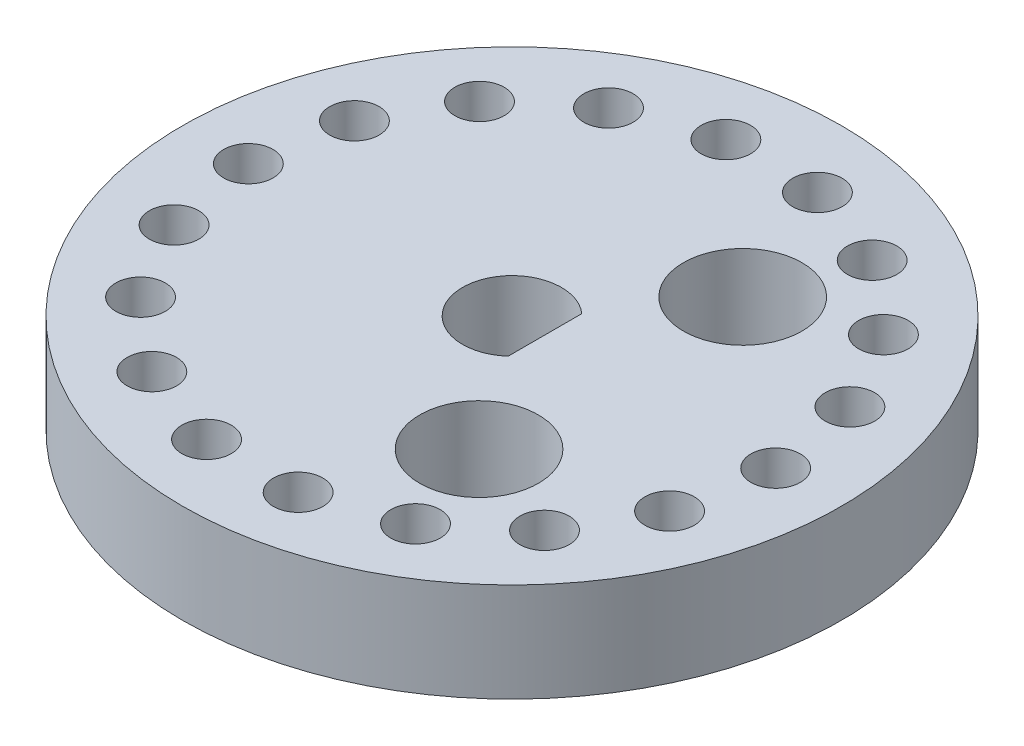
ISO-10303-21;
HEADER;
FILE_DESCRIPTION(('STEP AP214'),'2;1');
FILE_NAME('part.step','',(''),(''),'','','');
FILE_SCHEMA(('AUTOMOTIVE_DESIGN { 1 0 10303 214 1 1 1 1 }'));
ENDSEC;
DATA;
#1=APPLICATION_CONTEXT('core data for automotive mechanical design processes');
#2=APPLICATION_PROTOCOL_DEFINITION('international standard','automotive_design',2000,#1);
#3=PRODUCT_CONTEXT('',#1,'mechanical');
#4=PRODUCT('Part','Part','',(#3));
#5=PRODUCT_RELATED_PRODUCT_CATEGORY('part','',(#4));
#6=PRODUCT_DEFINITION_FORMATION('','',#4);
#7=PRODUCT_DEFINITION_CONTEXT('part definition',#1,'design');
#8=PRODUCT_DEFINITION('design','',#6,#7);
#9=PRODUCT_DEFINITION_SHAPE('','',#8);
#10=(LENGTH_UNIT() NAMED_UNIT(*) SI_UNIT(.MILLI.,.METRE.));
#11=(NAMED_UNIT(*) PLANE_ANGLE_UNIT() SI_UNIT($,.RADIAN.));
#12=(NAMED_UNIT(*) SI_UNIT($,.STERADIAN.) SOLID_ANGLE_UNIT());
#13=UNCERTAINTY_MEASURE_WITH_UNIT(LENGTH_MEASURE(1.E-05),#10,'distance_accuracy_value','');
#14=(GEOMETRIC_REPRESENTATION_CONTEXT(3) GLOBAL_UNCERTAINTY_ASSIGNED_CONTEXT((#13)) GLOBAL_UNIT_ASSIGNED_CONTEXT((#10,
#11,#12)) REPRESENTATION_CONTEXT('',''));
#15=CARTESIAN_POINT('',(0.,0.,0.));
#16=DIRECTION('',(0.,0.,1.));
#17=DIRECTION('',(1.,0.,0.));
#18=AXIS2_PLACEMENT_3D('',#15,#16,#17);
#19=CARTESIAN_POINT('',(0.,3.,0.));
#20=DIRECTION('',(0.,-1.,0.));
#21=DIRECTION('',(0.,0.,-1.));
#22=AXIS2_PLACEMENT_3D('',#19,#20,#21);
#23=CYLINDRICAL_SURFACE('',#22,10.);
#24=CARTESIAN_POINT('',(0.,3.,0.));
#25=DIRECTION('',(0.,1.,0.));
#26=DIRECTION('',(0.,0.,1.));
#27=AXIS2_PLACEMENT_3D('',#24,#25,#26);
#28=CIRCLE('',#27,10.);
#29=CARTESIAN_POINT('',(0.,3.,10.));
#30=VERTEX_POINT('',#29);
#31=EDGE_CURVE('E11',#30,#30,#28,.T.);
#32=ORIENTED_EDGE('',*,*,#31,.F.);
#33=EDGE_LOOP('',(#32));
#34=FACE_BOUND('',#33,.T.);
#35=CARTESIAN_POINT('',(0.,0.,0.));
#36=DIRECTION('',(0.,1.,0.));
#37=DIRECTION('',(0.,0.,1.));
#38=AXIS2_PLACEMENT_3D('',#35,#36,#37);
#39=CIRCLE('',#38,10.);
#40=CARTESIAN_POINT('',(0.,0.,10.));
#41=VERTEX_POINT('',#40);
#42=EDGE_CURVE('E41',#41,#41,#39,.T.);
#43=ORIENTED_EDGE('',*,*,#42,.T.);
#44=EDGE_LOOP('',(#43));
#45=FACE_BOUND('',#44,.T.);
#46=ADVANCED_FACE('F38',(#34,#45),#23,.T.);
#47=CARTESIAN_POINT('',(0.,3.,0.));
#48=DIRECTION('',(0.,1.,0.));
#49=DIRECTION('',(0.,0.,1.));
#50=AXIS2_PLACEMENT_3D('',#47,#48,#49);
#51=PLANE('',#50);
#52=CARTESIAN_POINT('',(0.,3.,0.));
#53=DIRECTION('',(0.,1.,0.));
#54=DIRECTION('',(0.,0.,1.));
#55=AXIS2_PLACEMENT_3D('',#52,#53,#54);
#56=CIRCLE('',#55,1.5);
#57=CARTESIAN_POINT('',(1.,3.,-1.1180339887499));
#58=VERTEX_POINT('',#57);
#59=CARTESIAN_POINT('',(1.,3.,1.1180339887499));
#60=VERTEX_POINT('',#59);
#61=EDGE_CURVE('E52',#58,#60,#56,.T.);
#62=ORIENTED_EDGE('',*,*,#61,.F.);
#63=DIRECTION('',(0.,0.,-1.));
#64=VECTOR('',#63,1.);
#65=CARTESIAN_POINT('',(1.,3.,-1.1180339887499));
#66=LINE('',#65,#64);
#67=EDGE_CURVE('E69',#60,#58,#66,.T.);
#68=ORIENTED_EDGE('',*,*,#67,.F.);
#69=EDGE_LOOP('',(#62,#68));
#70=FACE_BOUND('',#69,.T.);
#71=CARTESIAN_POINT('',(3.,3.,4.));
#72=DIRECTION('',(0.,1.,0.));
#73=DIRECTION('',(0.,0.,1.));
#74=AXIS2_PLACEMENT_3D('',#71,#72,#73);
#75=CIRCLE('',#74,1.8);
#76=CARTESIAN_POINT('',(3.,3.,5.8));
#77=VERTEX_POINT('',#76);
#78=EDGE_CURVE('E88',#77,#77,#75,.T.);
#79=ORIENTED_EDGE('',*,*,#78,.F.);
#80=EDGE_LOOP('',(#79));
#81=FACE_BOUND('',#80,.T.);
#82=CARTESIAN_POINT('',(3.,3.,-4.));
#83=DIRECTION('',(0.,1.,0.));
#84=DIRECTION('',(0.,0.,-1.));
#85=AXIS2_PLACEMENT_3D('',#82,#83,#84);
#86=CIRCLE('',#85,1.8);
#87=CARTESIAN_POINT('',(3.,3.,-5.8));
#88=VERTEX_POINT('',#87);
#89=EDGE_CURVE('E75',#88,#88,#86,.T.);
#90=ORIENTED_EDGE('',*,*,#89,.F.);
#91=EDGE_LOOP('',(#90));
#92=FACE_BOUND('',#91,.T.);
#93=CARTESIAN_POINT('',(7.51754096628726,3.,2.73616114660536));
#94=DIRECTION('',(0.,1.,0.));
#95=DIRECTION('',(0.,0.,1.));
#96=AXIS2_PLACEMENT_3D('',#93,#94,#95);
#97=CIRCLE('',#96,0.750000000000001);
#98=CARTESIAN_POINT('',(7.51754096628726,3.,3.48616114660536));
#99=VERTEX_POINT('',#98);
#100=EDGE_CURVE('E106',#99,#99,#97,.T.);
#101=ORIENTED_EDGE('',*,*,#100,.F.);
#102=EDGE_LOOP('',(#101));
#103=FACE_BOUND('',#102,.T.);
#104=CARTESIAN_POINT('',(6.12835554495182,3.,5.14230087749233));
#105=DIRECTION('',(0.,1.,0.));
#106=DIRECTION('',(0.,0.,1.));
#107=AXIS2_PLACEMENT_3D('',#104,#105,#106);
#108=CIRCLE('',#107,0.750000000000001);
#109=CARTESIAN_POINT('',(6.12835554495182,3.,5.89230087749233));
#110=VERTEX_POINT('',#109);
#111=EDGE_CURVE('E112',#110,#110,#108,.T.);
#112=ORIENTED_EDGE('',*,*,#111,.F.);
#113=EDGE_LOOP('',(#112));
#114=FACE_BOUND('',#113,.T.);
#115=CARTESIAN_POINT('',(3.99999999999998,3.,6.92820323027552));
#116=DIRECTION('',(0.,1.,0.));
#117=DIRECTION('',(0.,0.,1.));
#118=AXIS2_PLACEMENT_3D('',#115,#116,#117);
#119=CIRCLE('',#118,0.75);
#120=CARTESIAN_POINT('',(3.99999999999998,3.,7.67820323027552));
#121=VERTEX_POINT('',#120);
#122=EDGE_CURVE('E118',#121,#121,#119,.T.);
#123=ORIENTED_EDGE('',*,*,#122,.F.);
#124=EDGE_LOOP('',(#123));
#125=FACE_BOUND('',#124,.T.);
#126=CARTESIAN_POINT('',(1.38918542133542,3.,7.87846202409767));
#127=DIRECTION('',(0.,1.,0.));
#128=DIRECTION('',(0.,0.,1.));
#129=AXIS2_PLACEMENT_3D('',#126,#127,#128);
#130=CIRCLE('',#129,0.75);
#131=CARTESIAN_POINT('',(1.38918542133542,3.,8.62846202409767));
#132=VERTEX_POINT('',#131);
#133=EDGE_CURVE('E124',#132,#132,#130,.T.);
#134=ORIENTED_EDGE('',*,*,#133,.F.);
#135=EDGE_LOOP('',(#134));
#136=FACE_BOUND('',#135,.T.);
#137=CARTESIAN_POINT('',(-1.38918542133547,3.,7.87846202409766));
#138=DIRECTION('',(0.,1.,0.));
#139=DIRECTION('',(0.,0.,1.));
#140=AXIS2_PLACEMENT_3D('',#137,#138,#139);
#141=CIRCLE('',#140,0.749999999999999);
#142=CARTESIAN_POINT('',(-1.38918542133547,3.,8.62846202409766));
#143=VERTEX_POINT('',#142);
#144=EDGE_CURVE('E130',#143,#143,#141,.T.);
#145=ORIENTED_EDGE('',*,*,#144,.F.);
#146=EDGE_LOOP('',(#145));
#147=FACE_BOUND('',#146,.T.);
#148=CARTESIAN_POINT('',(-4.00000000000003,3.,6.92820323027549));
#149=DIRECTION('',(0.,1.,0.));
#150=DIRECTION('',(0.,0.,1.));
#151=AXIS2_PLACEMENT_3D('',#148,#149,#150);
#152=CIRCLE('',#151,0.75);
#153=CARTESIAN_POINT('',(-4.00000000000003,3.,7.67820323027549));
#154=VERTEX_POINT('',#153);
#155=EDGE_CURVE('E136',#154,#154,#152,.T.);
#156=ORIENTED_EDGE('',*,*,#155,.F.);
#157=EDGE_LOOP('',(#156));
#158=FACE_BOUND('',#157,.T.);
#159=CARTESIAN_POINT('',(-6.12835554495185,3.,5.14230087749228));
#160=DIRECTION('',(0.,1.,0.));
#161=DIRECTION('',(0.,0.,1.));
#162=AXIS2_PLACEMENT_3D('',#159,#160,#161);
#163=CIRCLE('',#162,0.75);
#164=CARTESIAN_POINT('',(-6.12835554495185,3.,5.89230087749228));
#165=VERTEX_POINT('',#164);
#166=EDGE_CURVE('E142',#165,#165,#163,.T.);
#167=ORIENTED_EDGE('',*,*,#166,.F.);
#168=EDGE_LOOP('',(#167));
#169=FACE_BOUND('',#168,.T.);
#170=CARTESIAN_POINT('',(-7.51754096628728,3.,2.7361611466053));
#171=DIRECTION('',(0.,1.,0.));
#172=DIRECTION('',(0.,0.,1.));
#173=AXIS2_PLACEMENT_3D('',#170,#171,#172);
#174=CIRCLE('',#173,0.75);
#175=CARTESIAN_POINT('',(-7.51754096628728,3.,3.4861611466053));
#176=VERTEX_POINT('',#175);
#177=EDGE_CURVE('E148',#176,#176,#174,.T.);
#178=ORIENTED_EDGE('',*,*,#177,.F.);
#179=EDGE_LOOP('',(#178));
#180=FACE_BOUND('',#179,.T.);
#181=CARTESIAN_POINT('',(-8.,3.,0.));
#182=DIRECTION('',(0.,1.,0.));
#183=DIRECTION('',(0.,0.,1.));
#184=AXIS2_PLACEMENT_3D('',#181,#182,#183);
#185=CIRCLE('',#184,0.750000000000001);
#186=CARTESIAN_POINT('',(-8.,3.,0.749999999999945));
#187=VERTEX_POINT('',#186);
#188=EDGE_CURVE('E154',#187,#187,#185,.T.);
#189=ORIENTED_EDGE('',*,*,#188,.F.);
#190=EDGE_LOOP('',(#189));
#191=FACE_BOUND('',#190,.T.);
#192=CARTESIAN_POINT('',(-7.51754096628725,3.,-2.73616114660541));
#193=DIRECTION('',(0.,1.,0.));
#194=DIRECTION('',(0.,0.,1.));
#195=AXIS2_PLACEMENT_3D('',#192,#193,#194);
#196=CIRCLE('',#195,0.75);
#197=CARTESIAN_POINT('',(-7.51754096628725,3.,-1.98616114660541));
#198=VERTEX_POINT('',#197);
#199=EDGE_CURVE('E160',#198,#198,#196,.T.);
#200=ORIENTED_EDGE('',*,*,#199,.F.);
#201=EDGE_LOOP('',(#200));
#202=FACE_BOUND('',#201,.T.);
#203=CARTESIAN_POINT('',(-6.12835554495178,3.,-5.14230087749237));
#204=DIRECTION('',(0.,1.,0.));
#205=DIRECTION('',(0.,0.,1.));
#206=AXIS2_PLACEMENT_3D('',#203,#204,#205);
#207=CIRCLE('',#206,0.75);
#208=CARTESIAN_POINT('',(-6.12835554495178,3.,-4.39230087749237));
#209=VERTEX_POINT('',#208);
#210=EDGE_CURVE('E166',#209,#209,#207,.T.);
#211=ORIENTED_EDGE('',*,*,#210,.F.);
#212=EDGE_LOOP('',(#211));
#213=FACE_BOUND('',#212,.T.);
#214=CARTESIAN_POINT('',(-3.99999999999994,3.,-6.92820323027555));
#215=DIRECTION('',(0.,1.,0.));
#216=DIRECTION('',(0.,0.,1.));
#217=AXIS2_PLACEMENT_3D('',#214,#215,#216);
#218=CIRCLE('',#217,0.75);
#219=CARTESIAN_POINT('',(-3.99999999999994,3.,-6.17820323027555));
#220=VERTEX_POINT('',#219);
#221=EDGE_CURVE('E172',#220,#220,#218,.T.);
#222=ORIENTED_EDGE('',*,*,#221,.F.);
#223=EDGE_LOOP('',(#222));
#224=FACE_BOUND('',#223,.T.);
#225=CARTESIAN_POINT('',(-1.38918542133537,3.,-7.87846202409768));
#226=DIRECTION('',(0.,1.,0.));
#227=DIRECTION('',(0.,0.,1.));
#228=AXIS2_PLACEMENT_3D('',#225,#226,#227);
#229=CIRCLE('',#228,0.750000000000001);
#230=CARTESIAN_POINT('',(-1.38918542133537,3.,-7.12846202409768));
#231=VERTEX_POINT('',#230);
#232=EDGE_CURVE('E178',#231,#231,#229,.T.);
#233=ORIENTED_EDGE('',*,*,#232,.F.);
#234=EDGE_LOOP('',(#233));
#235=FACE_BOUND('',#234,.T.);
#236=CARTESIAN_POINT('',(1.38918542133552,3.,-7.87846202409765));
#237=DIRECTION('',(0.,1.,0.));
#238=DIRECTION('',(0.,0.,1.));
#239=AXIS2_PLACEMENT_3D('',#236,#237,#238);
#240=CIRCLE('',#239,0.75);
#241=CARTESIAN_POINT('',(1.38918542133552,3.,-7.12846202409765));
#242=VERTEX_POINT('',#241);
#243=EDGE_CURVE('E184',#242,#242,#240,.T.);
#244=ORIENTED_EDGE('',*,*,#243,.F.);
#245=EDGE_LOOP('',(#244));
#246=FACE_BOUND('',#245,.T.);
#247=CARTESIAN_POINT('',(4.00000000000008,3.,-6.92820323027546));
#248=DIRECTION('',(0.,1.,0.));
#249=DIRECTION('',(0.,0.,1.));
#250=AXIS2_PLACEMENT_3D('',#247,#248,#249);
#251=CIRCLE('',#250,0.75);
#252=CARTESIAN_POINT('',(4.00000000000008,3.,-6.17820323027546));
#253=VERTEX_POINT('',#252);
#254=EDGE_CURVE('E190',#253,#253,#251,.T.);
#255=ORIENTED_EDGE('',*,*,#254,.F.);
#256=EDGE_LOOP('',(#255));
#257=FACE_BOUND('',#256,.T.);
#258=CARTESIAN_POINT('',(6.12835554495189,3.,-5.14230087749224));
#259=DIRECTION('',(0.,1.,0.));
#260=DIRECTION('',(0.,0.,1.));
#261=AXIS2_PLACEMENT_3D('',#258,#259,#260);
#262=CIRCLE('',#261,0.75);
#263=CARTESIAN_POINT('',(6.12835554495189,3.,-4.39230087749224));
#264=VERTEX_POINT('',#263);
#265=EDGE_CURVE('E99',#264,#264,#262,.T.);
#266=ORIENTED_EDGE('',*,*,#265,.F.);
#267=EDGE_LOOP('',(#266));
#268=FACE_BOUND('',#267,.T.);
#269=CARTESIAN_POINT('',(7.5175409662873,3.,-2.73616114660526));
#270=DIRECTION('',(0.,1.,0.));
#271=DIRECTION('',(0.,0.,1.));
#272=AXIS2_PLACEMENT_3D('',#269,#270,#271);
#273=CIRCLE('',#272,0.750000000000001);
#274=CARTESIAN_POINT('',(7.5175409662873,3.,-1.98616114660525));
#275=VERTEX_POINT('',#274);
#276=EDGE_CURVE('E87',#275,#275,#273,.T.);
#277=ORIENTED_EDGE('',*,*,#276,.F.);
#278=EDGE_LOOP('',(#277));
#279=FACE_BOUND('',#278,.T.);
#280=CARTESIAN_POINT('',(8.,3.,0.));
#281=DIRECTION('',(0.,1.,0.));
#282=DIRECTION('',(0.,0.,1.));
#283=AXIS2_PLACEMENT_3D('',#280,#281,#282);
#284=CIRCLE('',#283,0.75);
#285=CARTESIAN_POINT('',(8.,3.,0.75));
#286=VERTEX_POINT('',#285);
#287=EDGE_CURVE('E105',#286,#286,#284,.T.);
#288=ORIENTED_EDGE('',*,*,#287,.F.);
#289=EDGE_LOOP('',(#288));
#290=FACE_BOUND('',#289,.T.);
#291=ORIENTED_EDGE('',*,*,#31,.T.);
#292=EDGE_LOOP('',(#291));
#293=FACE_BOUND('',#292,.T.);
#294=ADVANCED_FACE('F206',(#70,#81,#92,#103,#114,#125,#136,#147,#158,#169,#180,#191,#202,#213,
#224,#235,#246,#257,#268,#279,#290,#293),#51,.T.);
#295=CARTESIAN_POINT('',(0.,0.,0.));
#296=DIRECTION('',(0.,1.,0.));
#297=DIRECTION('',(0.,0.,1.));
#298=AXIS2_PLACEMENT_3D('',#295,#296,#297);
#299=PLANE('',#298);
#300=DIRECTION('',(0.,0.,1.));
#301=VECTOR('',#300,1.);
#302=CARTESIAN_POINT('',(1.,0.,-1.1180339887499));
#303=LINE('',#302,#301);
#304=CARTESIAN_POINT('',(1.,0.,-1.1180339887499));
#305=VERTEX_POINT('',#304);
#306=CARTESIAN_POINT('',(1.,0.,1.11803398874989));
#307=VERTEX_POINT('',#306);
#308=EDGE_CURVE('E72',#305,#307,#303,.T.);
#309=ORIENTED_EDGE('',*,*,#308,.F.);
#310=CARTESIAN_POINT('',(0.,0.,0.));
#311=DIRECTION('',(0.,1.,0.));
#312=DIRECTION('',(0.,0.,1.));
#313=AXIS2_PLACEMENT_3D('',#310,#311,#312);
#314=CIRCLE('',#313,1.5);
#315=EDGE_CURVE('E57',#307,#305,#314,.F.);
#316=ORIENTED_EDGE('',*,*,#315,.F.);
#317=EDGE_LOOP('',(#309,#316));
#318=FACE_BOUND('',#317,.T.);
#319=CARTESIAN_POINT('',(3.,0.,4.));
#320=DIRECTION('',(0.,1.,0.));
#321=DIRECTION('',(0.,0.,1.));
#322=AXIS2_PLACEMENT_3D('',#319,#320,#321);
#323=CIRCLE('',#322,1.8);
#324=CARTESIAN_POINT('',(3.,0.,5.8));
#325=VERTEX_POINT('',#324);
#326=EDGE_CURVE('E84',#325,#325,#323,.T.);
#327=ORIENTED_EDGE('',*,*,#326,.T.);
#328=EDGE_LOOP('',(#327));
#329=FACE_BOUND('',#328,.T.);
#330=CARTESIAN_POINT('',(3.,0.,-4.));
#331=DIRECTION('',(0.,1.,0.));
#332=DIRECTION('',(0.,0.,-1.));
#333=AXIS2_PLACEMENT_3D('',#330,#331,#332);
#334=CIRCLE('',#333,1.8);
#335=CARTESIAN_POINT('',(3.,0.,-5.8));
#336=VERTEX_POINT('',#335);
#337=EDGE_CURVE('E91',#336,#336,#334,.T.);
#338=ORIENTED_EDGE('',*,*,#337,.T.);
#339=EDGE_LOOP('',(#338));
#340=FACE_BOUND('',#339,.T.);
#341=CARTESIAN_POINT('',(7.51754096628726,0.,2.73616114660536));
#342=DIRECTION('',(0.,1.,0.));
#343=DIRECTION('',(0.,0.,1.));
#344=AXIS2_PLACEMENT_3D('',#341,#342,#343);
#345=CIRCLE('',#344,0.750000000000001);
#346=CARTESIAN_POINT('',(7.51754096628726,0.,3.48616114660536));
#347=VERTEX_POINT('',#346);
#348=EDGE_CURVE('E102',#347,#347,#345,.T.);
#349=ORIENTED_EDGE('',*,*,#348,.T.);
#350=EDGE_LOOP('',(#349));
#351=FACE_BOUND('',#350,.T.);
#352=CARTESIAN_POINT('',(6.12835554495182,0.,5.14230087749233));
#353=DIRECTION('',(0.,1.,0.));
#354=DIRECTION('',(0.,0.,1.));
#355=AXIS2_PLACEMENT_3D('',#352,#353,#354);
#356=CIRCLE('',#355,0.750000000000001);
#357=CARTESIAN_POINT('',(6.12835554495182,0.,5.89230087749233));
#358=VERTEX_POINT('',#357);
#359=EDGE_CURVE('E109',#358,#358,#356,.T.);
#360=ORIENTED_EDGE('',*,*,#359,.T.);
#361=EDGE_LOOP('',(#360));
#362=FACE_BOUND('',#361,.T.);
#363=CARTESIAN_POINT('',(3.99999999999998,0.,6.92820323027552));
#364=DIRECTION('',(0.,1.,0.));
#365=DIRECTION('',(0.,0.,1.));
#366=AXIS2_PLACEMENT_3D('',#363,#364,#365);
#367=CIRCLE('',#366,0.75);
#368=CARTESIAN_POINT('',(3.99999999999998,0.,7.67820323027552));
#369=VERTEX_POINT('',#368);
#370=EDGE_CURVE('E115',#369,#369,#367,.T.);
#371=ORIENTED_EDGE('',*,*,#370,.T.);
#372=EDGE_LOOP('',(#371));
#373=FACE_BOUND('',#372,.T.);
#374=CARTESIAN_POINT('',(1.38918542133542,0.,7.87846202409767));
#375=DIRECTION('',(0.,1.,0.));
#376=DIRECTION('',(0.,0.,1.));
#377=AXIS2_PLACEMENT_3D('',#374,#375,#376);
#378=CIRCLE('',#377,0.75);
#379=CARTESIAN_POINT('',(1.38918542133542,0.,8.62846202409767));
#380=VERTEX_POINT('',#379);
#381=EDGE_CURVE('E121',#380,#380,#378,.T.);
#382=ORIENTED_EDGE('',*,*,#381,.T.);
#383=EDGE_LOOP('',(#382));
#384=FACE_BOUND('',#383,.T.);
#385=CARTESIAN_POINT('',(-1.38918542133547,0.,7.87846202409766));
#386=DIRECTION('',(0.,1.,0.));
#387=DIRECTION('',(0.,0.,1.));
#388=AXIS2_PLACEMENT_3D('',#385,#386,#387);
#389=CIRCLE('',#388,0.749999999999999);
#390=CARTESIAN_POINT('',(-1.38918542133547,0.,8.62846202409766));
#391=VERTEX_POINT('',#390);
#392=EDGE_CURVE('E127',#391,#391,#389,.T.);
#393=ORIENTED_EDGE('',*,*,#392,.T.);
#394=EDGE_LOOP('',(#393));
#395=FACE_BOUND('',#394,.T.);
#396=CARTESIAN_POINT('',(-4.00000000000003,0.,6.92820323027549));
#397=DIRECTION('',(0.,1.,0.));
#398=DIRECTION('',(0.,0.,1.));
#399=AXIS2_PLACEMENT_3D('',#396,#397,#398);
#400=CIRCLE('',#399,0.75);
#401=CARTESIAN_POINT('',(-4.00000000000003,0.,7.67820323027549));
#402=VERTEX_POINT('',#401);
#403=EDGE_CURVE('E133',#402,#402,#400,.T.);
#404=ORIENTED_EDGE('',*,*,#403,.T.);
#405=EDGE_LOOP('',(#404));
#406=FACE_BOUND('',#405,.T.);
#407=CARTESIAN_POINT('',(-6.12835554495185,0.,5.14230087749228));
#408=DIRECTION('',(0.,1.,0.));
#409=DIRECTION('',(0.,0.,1.));
#410=AXIS2_PLACEMENT_3D('',#407,#408,#409);
#411=CIRCLE('',#410,0.75);
#412=CARTESIAN_POINT('',(-6.12835554495185,0.,5.89230087749228));
#413=VERTEX_POINT('',#412);
#414=EDGE_CURVE('E139',#413,#413,#411,.T.);
#415=ORIENTED_EDGE('',*,*,#414,.T.);
#416=EDGE_LOOP('',(#415));
#417=FACE_BOUND('',#416,.T.);
#418=CARTESIAN_POINT('',(-7.51754096628728,0.,2.7361611466053));
#419=DIRECTION('',(0.,1.,0.));
#420=DIRECTION('',(0.,0.,1.));
#421=AXIS2_PLACEMENT_3D('',#418,#419,#420);
#422=CIRCLE('',#421,0.75);
#423=CARTESIAN_POINT('',(-7.51754096628728,0.,3.4861611466053));
#424=VERTEX_POINT('',#423);
#425=EDGE_CURVE('E145',#424,#424,#422,.T.);
#426=ORIENTED_EDGE('',*,*,#425,.T.);
#427=EDGE_LOOP('',(#426));
#428=FACE_BOUND('',#427,.T.);
#429=CARTESIAN_POINT('',(-8.,0.,0.));
#430=DIRECTION('',(0.,1.,0.));
#431=DIRECTION('',(0.,0.,1.));
#432=AXIS2_PLACEMENT_3D('',#429,#430,#431);
#433=CIRCLE('',#432,0.750000000000001);
#434=CARTESIAN_POINT('',(-8.,0.,0.749999999999945));
#435=VERTEX_POINT('',#434);
#436=EDGE_CURVE('E151',#435,#435,#433,.T.);
#437=ORIENTED_EDGE('',*,*,#436,.T.);
#438=EDGE_LOOP('',(#437));
#439=FACE_BOUND('',#438,.T.);
#440=CARTESIAN_POINT('',(-7.51754096628725,0.,-2.73616114660541));
#441=DIRECTION('',(0.,1.,0.));
#442=DIRECTION('',(0.,0.,1.));
#443=AXIS2_PLACEMENT_3D('',#440,#441,#442);
#444=CIRCLE('',#443,0.75);
#445=CARTESIAN_POINT('',(-7.51754096628725,0.,-1.98616114660541));
#446=VERTEX_POINT('',#445);
#447=EDGE_CURVE('E157',#446,#446,#444,.T.);
#448=ORIENTED_EDGE('',*,*,#447,.T.);
#449=EDGE_LOOP('',(#448));
#450=FACE_BOUND('',#449,.T.);
#451=CARTESIAN_POINT('',(-6.12835554495178,0.,-5.14230087749237));
#452=DIRECTION('',(0.,1.,0.));
#453=DIRECTION('',(0.,0.,1.));
#454=AXIS2_PLACEMENT_3D('',#451,#452,#453);
#455=CIRCLE('',#454,0.75);
#456=CARTESIAN_POINT('',(-6.12835554495178,0.,-4.39230087749237));
#457=VERTEX_POINT('',#456);
#458=EDGE_CURVE('E163',#457,#457,#455,.T.);
#459=ORIENTED_EDGE('',*,*,#458,.T.);
#460=EDGE_LOOP('',(#459));
#461=FACE_BOUND('',#460,.T.);
#462=CARTESIAN_POINT('',(-3.99999999999994,0.,-6.92820323027555));
#463=DIRECTION('',(0.,1.,0.));
#464=DIRECTION('',(0.,0.,1.));
#465=AXIS2_PLACEMENT_3D('',#462,#463,#464);
#466=CIRCLE('',#465,0.75);
#467=CARTESIAN_POINT('',(-3.99999999999994,0.,-6.17820323027555));
#468=VERTEX_POINT('',#467);
#469=EDGE_CURVE('E169',#468,#468,#466,.T.);
#470=ORIENTED_EDGE('',*,*,#469,.T.);
#471=EDGE_LOOP('',(#470));
#472=FACE_BOUND('',#471,.T.);
#473=CARTESIAN_POINT('',(-1.38918542133537,0.,-7.87846202409768));
#474=DIRECTION('',(0.,1.,0.));
#475=DIRECTION('',(0.,0.,1.));
#476=AXIS2_PLACEMENT_3D('',#473,#474,#475);
#477=CIRCLE('',#476,0.750000000000001);
#478=CARTESIAN_POINT('',(-1.38918542133537,0.,-7.12846202409768));
#479=VERTEX_POINT('',#478);
#480=EDGE_CURVE('E175',#479,#479,#477,.T.);
#481=ORIENTED_EDGE('',*,*,#480,.T.);
#482=EDGE_LOOP('',(#481));
#483=FACE_BOUND('',#482,.T.);
#484=CARTESIAN_POINT('',(1.38918542133552,0.,-7.87846202409765));
#485=DIRECTION('',(0.,1.,0.));
#486=DIRECTION('',(0.,0.,1.));
#487=AXIS2_PLACEMENT_3D('',#484,#485,#486);
#488=CIRCLE('',#487,0.75);
#489=CARTESIAN_POINT('',(1.38918542133552,0.,-7.12846202409765));
#490=VERTEX_POINT('',#489);
#491=EDGE_CURVE('E181',#490,#490,#488,.T.);
#492=ORIENTED_EDGE('',*,*,#491,.T.);
#493=EDGE_LOOP('',(#492));
#494=FACE_BOUND('',#493,.T.);
#495=CARTESIAN_POINT('',(4.00000000000008,0.,-6.92820323027546));
#496=DIRECTION('',(0.,1.,0.));
#497=DIRECTION('',(0.,0.,1.));
#498=AXIS2_PLACEMENT_3D('',#495,#496,#497);
#499=CIRCLE('',#498,0.75);
#500=CARTESIAN_POINT('',(4.00000000000008,0.,-6.17820323027546));
#501=VERTEX_POINT('',#500);
#502=EDGE_CURVE('E187',#501,#501,#499,.T.);
#503=ORIENTED_EDGE('',*,*,#502,.T.);
#504=EDGE_LOOP('',(#503));
#505=FACE_BOUND('',#504,.T.);
#506=CARTESIAN_POINT('',(6.12835554495189,0.,-5.14230087749224));
#507=DIRECTION('',(0.,1.,0.));
#508=DIRECTION('',(0.,0.,1.));
#509=AXIS2_PLACEMENT_3D('',#506,#507,#508);
#510=CIRCLE('',#509,0.75);
#511=CARTESIAN_POINT('',(6.12835554495189,0.,-4.39230087749224));
#512=VERTEX_POINT('',#511);
#513=EDGE_CURVE('E193',#512,#512,#510,.T.);
#514=ORIENTED_EDGE('',*,*,#513,.T.);
#515=EDGE_LOOP('',(#514));
#516=FACE_BOUND('',#515,.T.);
#517=CARTESIAN_POINT('',(7.5175409662873,0.,-2.73616114660526));
#518=DIRECTION('',(0.,1.,0.));
#519=DIRECTION('',(0.,0.,1.));
#520=AXIS2_PLACEMENT_3D('',#517,#518,#519);
#521=CIRCLE('',#520,0.750000000000001);
#522=CARTESIAN_POINT('',(7.5175409662873,0.,-1.98616114660525));
#523=VERTEX_POINT('',#522);
#524=EDGE_CURVE('E96',#523,#523,#521,.T.);
#525=ORIENTED_EDGE('',*,*,#524,.T.);
#526=EDGE_LOOP('',(#525));
#527=FACE_BOUND('',#526,.T.);
#528=CARTESIAN_POINT('',(8.,0.,0.));
#529=DIRECTION('',(0.,1.,0.));
#530=DIRECTION('',(0.,0.,1.));
#531=AXIS2_PLACEMENT_3D('',#528,#529,#530);
#532=CIRCLE('',#531,0.75);
#533=CARTESIAN_POINT('',(8.,0.,0.75));
#534=VERTEX_POINT('',#533);
#535=EDGE_CURVE('E198',#534,#534,#532,.T.);
#536=ORIENTED_EDGE('',*,*,#535,.T.);
#537=EDGE_LOOP('',(#536));
#538=FACE_BOUND('',#537,.T.);
#539=ORIENTED_EDGE('',*,*,#42,.F.);
#540=EDGE_LOOP('',(#539));
#541=FACE_BOUND('',#540,.T.);
#542=ADVANCED_FACE('F77',(#318,#329,#340,#351,#362,#373,#384,#395,#406,#417,#428,#439,#450,#461,
#472,#483,#494,#505,#516,#527,#538,#541),#299,.F.);
#543=CARTESIAN_POINT('',(8.,0.,0.));
#544=DIRECTION('',(0.,1.,0.));
#545=DIRECTION('',(0.,0.,1.));
#546=AXIS2_PLACEMENT_3D('',#543,#544,#545);
#547=CYLINDRICAL_SURFACE('',#546,0.75);
#548=ORIENTED_EDGE('',*,*,#535,.F.);
#549=EDGE_LOOP('',(#548));
#550=FACE_BOUND('',#549,.T.);
#551=ORIENTED_EDGE('',*,*,#287,.T.);
#552=EDGE_LOOP('',(#551));
#553=FACE_BOUND('',#552,.T.);
#554=ADVANCED_FACE('F204',(#550,#553),#547,.F.);
#555=CARTESIAN_POINT('',(7.5175409662873,0.,-2.73616114660526));
#556=DIRECTION('',(0.,1.,0.));
#557=DIRECTION('',(0.,0.,1.));
#558=AXIS2_PLACEMENT_3D('',#555,#556,#557);
#559=CYLINDRICAL_SURFACE('',#558,0.750000000000001);
#560=ORIENTED_EDGE('',*,*,#524,.F.);
#561=EDGE_LOOP('',(#560));
#562=FACE_BOUND('',#561,.T.);
#563=ORIENTED_EDGE('',*,*,#276,.T.);
#564=EDGE_LOOP('',(#563));
#565=FACE_BOUND('',#564,.T.);
#566=ADVANCED_FACE('F222',(#562,#565),#559,.F.);
#567=CARTESIAN_POINT('',(6.12835554495189,0.,-5.14230087749224));
#568=DIRECTION('',(0.,1.,0.));
#569=DIRECTION('',(0.,0.,1.));
#570=AXIS2_PLACEMENT_3D('',#567,#568,#569);
#571=CYLINDRICAL_SURFACE('',#570,0.75);
#572=ORIENTED_EDGE('',*,*,#513,.F.);
#573=EDGE_LOOP('',(#572));
#574=FACE_BOUND('',#573,.T.);
#575=ORIENTED_EDGE('',*,*,#265,.T.);
#576=EDGE_LOOP('',(#575));
#577=FACE_BOUND('',#576,.T.);
#578=ADVANCED_FACE('F226',(#574,#577),#571,.F.);
#579=CARTESIAN_POINT('',(4.00000000000008,0.,-6.92820323027546));
#580=DIRECTION('',(0.,1.,0.));
#581=DIRECTION('',(0.,0.,1.));
#582=AXIS2_PLACEMENT_3D('',#579,#580,#581);
#583=CYLINDRICAL_SURFACE('',#582,0.75);
#584=ORIENTED_EDGE('',*,*,#502,.F.);
#585=EDGE_LOOP('',(#584));
#586=FACE_BOUND('',#585,.T.);
#587=ORIENTED_EDGE('',*,*,#254,.T.);
#588=EDGE_LOOP('',(#587));
#589=FACE_BOUND('',#588,.T.);
#590=ADVANCED_FACE('F229',(#586,#589),#583,.F.);
#591=CARTESIAN_POINT('',(1.38918542133552,0.,-7.87846202409765));
#592=DIRECTION('',(0.,1.,0.));
#593=DIRECTION('',(0.,0.,1.));
#594=AXIS2_PLACEMENT_3D('',#591,#592,#593);
#595=CYLINDRICAL_SURFACE('',#594,0.75);
#596=ORIENTED_EDGE('',*,*,#491,.F.);
#597=EDGE_LOOP('',(#596));
#598=FACE_BOUND('',#597,.T.);
#599=ORIENTED_EDGE('',*,*,#243,.T.);
#600=EDGE_LOOP('',(#599));
#601=FACE_BOUND('',#600,.T.);
#602=ADVANCED_FACE('F233',(#598,#601),#595,.F.);
#603=CARTESIAN_POINT('',(-1.38918542133537,0.,-7.87846202409768));
#604=DIRECTION('',(0.,1.,0.));
#605=DIRECTION('',(0.,0.,1.));
#606=AXIS2_PLACEMENT_3D('',#603,#604,#605);
#607=CYLINDRICAL_SURFACE('',#606,0.750000000000001);
#608=ORIENTED_EDGE('',*,*,#480,.F.);
#609=EDGE_LOOP('',(#608));
#610=FACE_BOUND('',#609,.T.);
#611=ORIENTED_EDGE('',*,*,#232,.T.);
#612=EDGE_LOOP('',(#611));
#613=FACE_BOUND('',#612,.T.);
#614=ADVANCED_FACE('F237',(#610,#613),#607,.F.);
#615=CARTESIAN_POINT('',(-3.99999999999994,0.,-6.92820323027555));
#616=DIRECTION('',(0.,1.,0.));
#617=DIRECTION('',(0.,0.,1.));
#618=AXIS2_PLACEMENT_3D('',#615,#616,#617);
#619=CYLINDRICAL_SURFACE('',#618,0.75);
#620=ORIENTED_EDGE('',*,*,#469,.F.);
#621=EDGE_LOOP('',(#620));
#622=FACE_BOUND('',#621,.T.);
#623=ORIENTED_EDGE('',*,*,#221,.T.);
#624=EDGE_LOOP('',(#623));
#625=FACE_BOUND('',#624,.T.);
#626=ADVANCED_FACE('F241',(#622,#625),#619,.F.);
#627=CARTESIAN_POINT('',(-6.12835554495178,0.,-5.14230087749237));
#628=DIRECTION('',(0.,1.,0.));
#629=DIRECTION('',(0.,0.,1.));
#630=AXIS2_PLACEMENT_3D('',#627,#628,#629);
#631=CYLINDRICAL_SURFACE('',#630,0.75);
#632=ORIENTED_EDGE('',*,*,#458,.F.);
#633=EDGE_LOOP('',(#632));
#634=FACE_BOUND('',#633,.T.);
#635=ORIENTED_EDGE('',*,*,#210,.T.);
#636=EDGE_LOOP('',(#635));
#637=FACE_BOUND('',#636,.T.);
#638=ADVANCED_FACE('F245',(#634,#637),#631,.F.);
#639=CARTESIAN_POINT('',(-7.51754096628725,0.,-2.73616114660541));
#640=DIRECTION('',(0.,1.,0.));
#641=DIRECTION('',(0.,0.,1.));
#642=AXIS2_PLACEMENT_3D('',#639,#640,#641);
#643=CYLINDRICAL_SURFACE('',#642,0.75);
#644=ORIENTED_EDGE('',*,*,#447,.F.);
#645=EDGE_LOOP('',(#644));
#646=FACE_BOUND('',#645,.T.);
#647=ORIENTED_EDGE('',*,*,#199,.T.);
#648=EDGE_LOOP('',(#647));
#649=FACE_BOUND('',#648,.T.);
#650=ADVANCED_FACE('F249',(#646,#649),#643,.F.);
#651=CARTESIAN_POINT('',(-8.,0.,0.));
#652=DIRECTION('',(0.,1.,0.));
#653=DIRECTION('',(0.,0.,1.));
#654=AXIS2_PLACEMENT_3D('',#651,#652,#653);
#655=CYLINDRICAL_SURFACE('',#654,0.750000000000001);
#656=ORIENTED_EDGE('',*,*,#436,.F.);
#657=EDGE_LOOP('',(#656));
#658=FACE_BOUND('',#657,.T.);
#659=ORIENTED_EDGE('',*,*,#188,.T.);
#660=EDGE_LOOP('',(#659));
#661=FACE_BOUND('',#660,.T.);
#662=ADVANCED_FACE('F253',(#658,#661),#655,.F.);
#663=CARTESIAN_POINT('',(-7.51754096628728,0.,2.7361611466053));
#664=DIRECTION('',(0.,1.,0.));
#665=DIRECTION('',(0.,0.,1.));
#666=AXIS2_PLACEMENT_3D('',#663,#664,#665);
#667=CYLINDRICAL_SURFACE('',#666,0.75);
#668=ORIENTED_EDGE('',*,*,#425,.F.);
#669=EDGE_LOOP('',(#668));
#670=FACE_BOUND('',#669,.T.);
#671=ORIENTED_EDGE('',*,*,#177,.T.);
#672=EDGE_LOOP('',(#671));
#673=FACE_BOUND('',#672,.T.);
#674=ADVANCED_FACE('F257',(#670,#673),#667,.F.);
#675=CARTESIAN_POINT('',(-6.12835554495185,0.,5.14230087749228));
#676=DIRECTION('',(0.,1.,0.));
#677=DIRECTION('',(0.,0.,1.));
#678=AXIS2_PLACEMENT_3D('',#675,#676,#677);
#679=CYLINDRICAL_SURFACE('',#678,0.75);
#680=ORIENTED_EDGE('',*,*,#414,.F.);
#681=EDGE_LOOP('',(#680));
#682=FACE_BOUND('',#681,.T.);
#683=ORIENTED_EDGE('',*,*,#166,.T.);
#684=EDGE_LOOP('',(#683));
#685=FACE_BOUND('',#684,.T.);
#686=ADVANCED_FACE('F261',(#682,#685),#679,.F.);
#687=CARTESIAN_POINT('',(-4.00000000000003,0.,6.92820323027549));
#688=DIRECTION('',(0.,1.,0.));
#689=DIRECTION('',(0.,0.,1.));
#690=AXIS2_PLACEMENT_3D('',#687,#688,#689);
#691=CYLINDRICAL_SURFACE('',#690,0.75);
#692=ORIENTED_EDGE('',*,*,#403,.F.);
#693=EDGE_LOOP('',(#692));
#694=FACE_BOUND('',#693,.T.);
#695=ORIENTED_EDGE('',*,*,#155,.T.);
#696=EDGE_LOOP('',(#695));
#697=FACE_BOUND('',#696,.T.);
#698=ADVANCED_FACE('F265',(#694,#697),#691,.F.);
#699=CARTESIAN_POINT('',(-1.38918542133547,0.,7.87846202409766));
#700=DIRECTION('',(0.,1.,0.));
#701=DIRECTION('',(0.,0.,1.));
#702=AXIS2_PLACEMENT_3D('',#699,#700,#701);
#703=CYLINDRICAL_SURFACE('',#702,0.749999999999999);
#704=ORIENTED_EDGE('',*,*,#392,.F.);
#705=EDGE_LOOP('',(#704));
#706=FACE_BOUND('',#705,.T.);
#707=ORIENTED_EDGE('',*,*,#144,.T.);
#708=EDGE_LOOP('',(#707));
#709=FACE_BOUND('',#708,.T.);
#710=ADVANCED_FACE('F269',(#706,#709),#703,.F.);
#711=CARTESIAN_POINT('',(1.38918542133542,0.,7.87846202409767));
#712=DIRECTION('',(0.,1.,0.));
#713=DIRECTION('',(0.,0.,1.));
#714=AXIS2_PLACEMENT_3D('',#711,#712,#713);
#715=CYLINDRICAL_SURFACE('',#714,0.75);
#716=ORIENTED_EDGE('',*,*,#381,.F.);
#717=EDGE_LOOP('',(#716));
#718=FACE_BOUND('',#717,.T.);
#719=ORIENTED_EDGE('',*,*,#133,.T.);
#720=EDGE_LOOP('',(#719));
#721=FACE_BOUND('',#720,.T.);
#722=ADVANCED_FACE('F273',(#718,#721),#715,.F.);
#723=CARTESIAN_POINT('',(3.99999999999998,0.,6.92820323027552));
#724=DIRECTION('',(0.,1.,0.));
#725=DIRECTION('',(0.,0.,1.));
#726=AXIS2_PLACEMENT_3D('',#723,#724,#725);
#727=CYLINDRICAL_SURFACE('',#726,0.75);
#728=ORIENTED_EDGE('',*,*,#370,.F.);
#729=EDGE_LOOP('',(#728));
#730=FACE_BOUND('',#729,.T.);
#731=ORIENTED_EDGE('',*,*,#122,.T.);
#732=EDGE_LOOP('',(#731));
#733=FACE_BOUND('',#732,.T.);
#734=ADVANCED_FACE('F277',(#730,#733),#727,.F.);
#735=CARTESIAN_POINT('',(6.12835554495182,0.,5.14230087749233));
#736=DIRECTION('',(0.,1.,0.));
#737=DIRECTION('',(0.,0.,1.));
#738=AXIS2_PLACEMENT_3D('',#735,#736,#737);
#739=CYLINDRICAL_SURFACE('',#738,0.750000000000001);
#740=ORIENTED_EDGE('',*,*,#359,.F.);
#741=EDGE_LOOP('',(#740));
#742=FACE_BOUND('',#741,.T.);
#743=ORIENTED_EDGE('',*,*,#111,.T.);
#744=EDGE_LOOP('',(#743));
#745=FACE_BOUND('',#744,.T.);
#746=ADVANCED_FACE('F281',(#742,#745),#739,.F.);
#747=CARTESIAN_POINT('',(7.51754096628726,0.,2.73616114660536));
#748=DIRECTION('',(0.,1.,0.));
#749=DIRECTION('',(0.,0.,1.));
#750=AXIS2_PLACEMENT_3D('',#747,#748,#749);
#751=CYLINDRICAL_SURFACE('',#750,0.750000000000001);
#752=ORIENTED_EDGE('',*,*,#348,.F.);
#753=EDGE_LOOP('',(#752));
#754=FACE_BOUND('',#753,.T.);
#755=ORIENTED_EDGE('',*,*,#100,.T.);
#756=EDGE_LOOP('',(#755));
#757=FACE_BOUND('',#756,.T.);
#758=ADVANCED_FACE('F285',(#754,#757),#751,.F.);
#759=CARTESIAN_POINT('',(3.,0.,-4.));
#760=DIRECTION('',(0.,1.,0.));
#761=DIRECTION('',(0.,0.,1.));
#762=AXIS2_PLACEMENT_3D('',#759,#760,#761);
#763=CYLINDRICAL_SURFACE('',#762,1.8);
#764=ORIENTED_EDGE('',*,*,#337,.F.);
#765=EDGE_LOOP('',(#764));
#766=FACE_BOUND('',#765,.T.);
#767=ORIENTED_EDGE('',*,*,#89,.T.);
#768=EDGE_LOOP('',(#767));
#769=FACE_BOUND('',#768,.T.);
#770=ADVANCED_FACE('F289',(#766,#769),#763,.F.);
#771=CARTESIAN_POINT('',(3.,0.,4.));
#772=DIRECTION('',(0.,1.,0.));
#773=DIRECTION('',(0.,0.,1.));
#774=AXIS2_PLACEMENT_3D('',#771,#772,#773);
#775=CYLINDRICAL_SURFACE('',#774,1.8);
#776=ORIENTED_EDGE('',*,*,#326,.F.);
#777=EDGE_LOOP('',(#776));
#778=FACE_BOUND('',#777,.T.);
#779=ORIENTED_EDGE('',*,*,#78,.T.);
#780=EDGE_LOOP('',(#779));
#781=FACE_BOUND('',#780,.T.);
#782=ADVANCED_FACE('F296',(#778,#781),#775,.F.);
#783=CARTESIAN_POINT('',(0.,-0.00100000000000013,0.));
#784=DIRECTION('',(0.,1.,0.));
#785=DIRECTION('',(0.,0.,1.));
#786=AXIS2_PLACEMENT_3D('',#783,#784,#785);
#787=CYLINDRICAL_SURFACE('',#786,1.5);
#788=ORIENTED_EDGE('',*,*,#315,.T.);
#789=DIRECTION('',(0.,1.,0.));
#790=VECTOR('',#789,1.);
#791=CARTESIAN_POINT('',(1.,-0.00100000000000013,-1.1180339887499));
#792=LINE('',#791,#790);
#793=EDGE_CURVE('E68',#305,#58,#792,.T.);
#794=ORIENTED_EDGE('',*,*,#793,.T.);
#795=ORIENTED_EDGE('',*,*,#61,.T.);
#796=DIRECTION('',(0.,1.,0.));
#797=VECTOR('',#796,1.);
#798=CARTESIAN_POINT('',(1.,-0.00100000000000013,1.1180339887499));
#799=LINE('',#798,#797);
#800=EDGE_CURVE('E62',#307,#60,#799,.T.);
#801=ORIENTED_EDGE('',*,*,#800,.F.);
#802=EDGE_LOOP('',(#788,#794,#795,#801));
#803=FACE_BOUND('',#802,.T.);
#804=ADVANCED_FACE('F64',(#803),#787,.F.);
#805=CARTESIAN_POINT('',(1.,-0.00100000000000013,-1.1180339887499));
#806=DIRECTION('',(1.,0.,0.));
#807=DIRECTION('',(0.,0.,-1.));
#808=AXIS2_PLACEMENT_3D('',#805,#806,#807);
#809=PLANE('',#808);
#810=ORIENTED_EDGE('',*,*,#308,.T.);
#811=ORIENTED_EDGE('',*,*,#800,.T.);
#812=ORIENTED_EDGE('',*,*,#67,.T.);
#813=ORIENTED_EDGE('',*,*,#793,.F.);
#814=EDGE_LOOP('',(#810,#811,#812,#813));
#815=FACE_BOUND('',#814,.T.);
#816=ADVANCED_FACE('F73',(#815),#809,.F.);
#817=CLOSED_SHELL('',(#46,#294,#542,#554,#566,#578,#590,#602,#614,#626,#638,#650,#662,#674,#686,
#698,#710,#722,#734,#746,#758,#770,#782,#804,#816));
#818=MANIFOLD_SOLID_BREP('B2',#817);
#819=ADVANCED_BREP_SHAPE_REPRESENTATION('',(#18,#818),#14);
#820=SHAPE_DEFINITION_REPRESENTATION(#9,#819);
ENDSEC;
END-ISO-10303-21;
